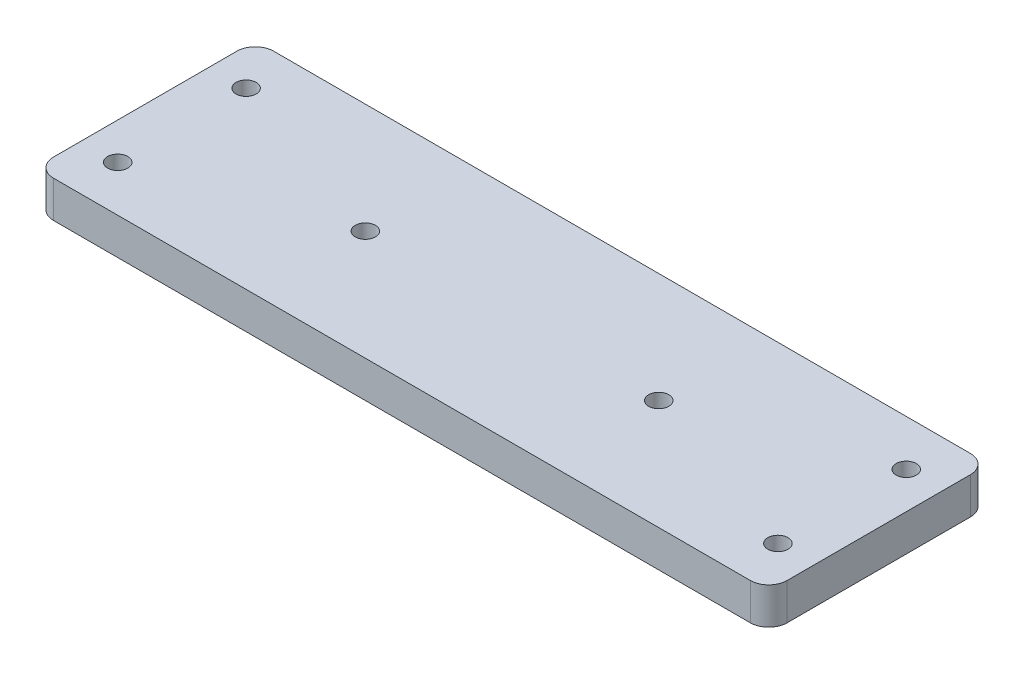
ISO-10303-21;
HEADER;
FILE_DESCRIPTION(('STEP AP214'),'2;1');
FILE_NAME('part.step','',(''),(''),'','','');
FILE_SCHEMA(('AUTOMOTIVE_DESIGN { 1 0 10303 214 1 1 1 1 }'));
ENDSEC;
DATA;
#1=APPLICATION_CONTEXT('core data for automotive mechanical design processes');
#2=APPLICATION_PROTOCOL_DEFINITION('international standard','automotive_design',2000,#1);
#3=PRODUCT_CONTEXT('',#1,'mechanical');
#4=PRODUCT('Part','Part','',(#3));
#5=PRODUCT_RELATED_PRODUCT_CATEGORY('part','',(#4));
#6=PRODUCT_DEFINITION_FORMATION('','',#4);
#7=PRODUCT_DEFINITION_CONTEXT('part definition',#1,'design');
#8=PRODUCT_DEFINITION('design','',#6,#7);
#9=PRODUCT_DEFINITION_SHAPE('','',#8);
#10=(LENGTH_UNIT() NAMED_UNIT(*) SI_UNIT(.MILLI.,.METRE.));
#11=(NAMED_UNIT(*) PLANE_ANGLE_UNIT() SI_UNIT($,.RADIAN.));
#12=(NAMED_UNIT(*) SI_UNIT($,.STERADIAN.) SOLID_ANGLE_UNIT());
#13=UNCERTAINTY_MEASURE_WITH_UNIT(LENGTH_MEASURE(1.E-05),#10,'distance_accuracy_value','');
#14=(GEOMETRIC_REPRESENTATION_CONTEXT(3) GLOBAL_UNCERTAINTY_ASSIGNED_CONTEXT((#13)) GLOBAL_UNIT_ASSIGNED_CONTEXT((#10,
#11,#12)) REPRESENTATION_CONTEXT('',''));
#15=CARTESIAN_POINT('',(0.,0.,0.));
#16=DIRECTION('',(0.,0.,1.));
#17=DIRECTION('',(1.,0.,0.));
#18=AXIS2_PLACEMENT_3D('',#15,#16,#17);
#19=CARTESIAN_POINT('',(95.,10.,-25.));
#20=DIRECTION('',(0.,1.,0.));
#21=DIRECTION('',(0.,0.,1.));
#22=AXIS2_PLACEMENT_3D('',#19,#20,#21);
#23=PLANE('',#22);
#24=CARTESIAN_POINT('',(-40.,10.,0.));
#25=DIRECTION('',(0.,1.,0.));
#26=DIRECTION('',(0.,0.,1.));
#27=AXIS2_PLACEMENT_3D('',#24,#25,#26);
#28=CIRCLE('',#27,2.75);
#29=CARTESIAN_POINT('',(-40.,10.,2.75));
#30=VERTEX_POINT('',#29);
#31=EDGE_CURVE('E203',#30,#30,#28,.T.);
#32=ORIENTED_EDGE('',*,*,#31,.F.);
#33=EDGE_LOOP('',(#32));
#34=FACE_BOUND('',#33,.T.);
#35=CARTESIAN_POINT('',(90.,10.,-17.5));
#36=DIRECTION('',(0.,1.,0.));
#37=DIRECTION('',(0.,0.,1.));
#38=AXIS2_PLACEMENT_3D('',#35,#36,#37);
#39=CIRCLE('',#38,2.75000000000001);
#40=CARTESIAN_POINT('',(90.,10.,-14.75));
#41=VERTEX_POINT('',#40);
#42=EDGE_CURVE('E191',#41,#41,#39,.T.);
#43=ORIENTED_EDGE('',*,*,#42,.F.);
#44=EDGE_LOOP('',(#43));
#45=FACE_BOUND('',#44,.T.);
#46=CARTESIAN_POINT('',(-90.,10.,-17.5));
#47=DIRECTION('',(0.,1.,0.));
#48=DIRECTION('',(0.,0.,1.));
#49=AXIS2_PLACEMENT_3D('',#46,#47,#48);
#50=CIRCLE('',#49,2.75000000000001);
#51=CARTESIAN_POINT('',(-90.,10.,-14.75));
#52=VERTEX_POINT('',#51);
#53=EDGE_CURVE('E137',#52,#52,#50,.T.);
#54=ORIENTED_EDGE('',*,*,#53,.F.);
#55=EDGE_LOOP('',(#54));
#56=FACE_BOUND('',#55,.T.);
#57=CARTESIAN_POINT('',(95.,10.,-25.));
#58=DIRECTION('',(0.,1.,0.));
#59=DIRECTION('',(0.,0.,1.));
#60=AXIS2_PLACEMENT_3D('',#57,#58,#59);
#61=CIRCLE('',#60,5.);
#62=CARTESIAN_POINT('',(100.,10.,-25.));
#63=VERTEX_POINT('',#62);
#64=CARTESIAN_POINT('',(95.,10.,-30.));
#65=VERTEX_POINT('',#64);
#66=EDGE_CURVE('E148',#63,#65,#61,.T.);
#67=ORIENTED_EDGE('',*,*,#66,.T.);
#68=DIRECTION('',(-1.,0.,0.));
#69=VECTOR('',#68,1.);
#70=CARTESIAN_POINT('',(-95.,10.,-30.));
#71=LINE('',#70,#69);
#72=CARTESIAN_POINT('',(-95.,10.,-30.));
#73=VERTEX_POINT('',#72);
#74=EDGE_CURVE('E96',#65,#73,#71,.T.);
#75=ORIENTED_EDGE('',*,*,#74,.T.);
#76=CARTESIAN_POINT('',(-95.,10.,-25.));
#77=DIRECTION('',(0.,1.,0.));
#78=DIRECTION('',(0.,0.,-1.));
#79=AXIS2_PLACEMENT_3D('',#76,#77,#78);
#80=CIRCLE('',#79,5.);
#81=CARTESIAN_POINT('',(-100.,10.,-25.));
#82=VERTEX_POINT('',#81);
#83=EDGE_CURVE('E163',#73,#82,#80,.T.);
#84=ORIENTED_EDGE('',*,*,#83,.T.);
#85=DIRECTION('',(0.,0.,1.));
#86=VECTOR('',#85,1.);
#87=CARTESIAN_POINT('',(-100.,10.,25.));
#88=LINE('',#87,#86);
#89=CARTESIAN_POINT('',(-100.,10.,25.));
#90=VERTEX_POINT('',#89);
#91=EDGE_CURVE('E176',#82,#90,#88,.T.);
#92=ORIENTED_EDGE('',*,*,#91,.T.);
#93=CARTESIAN_POINT('',(-95.,10.,25.));
#94=DIRECTION('',(0.,1.,0.));
#95=DIRECTION('',(0.,0.,-1.));
#96=AXIS2_PLACEMENT_3D('',#93,#94,#95);
#97=CIRCLE('',#96,5.);
#98=CARTESIAN_POINT('',(-95.,10.,30.));
#99=VERTEX_POINT('',#98);
#100=EDGE_CURVE('E115',#90,#99,#97,.T.);
#101=ORIENTED_EDGE('',*,*,#100,.T.);
#102=DIRECTION('',(1.,0.,0.));
#103=VECTOR('',#102,1.);
#104=CARTESIAN_POINT('',(-95.,10.,30.));
#105=LINE('',#104,#103);
#106=CARTESIAN_POINT('',(95.,10.,30.));
#107=VERTEX_POINT('',#106);
#108=EDGE_CURVE('E109',#99,#107,#105,.T.);
#109=ORIENTED_EDGE('',*,*,#108,.T.);
#110=CARTESIAN_POINT('',(95.,10.,25.));
#111=DIRECTION('',(0.,1.,0.));
#112=DIRECTION('',(0.,0.,1.));
#113=AXIS2_PLACEMENT_3D('',#110,#111,#112);
#114=CIRCLE('',#113,5.);
#115=CARTESIAN_POINT('',(100.,10.,25.));
#116=VERTEX_POINT('',#115);
#117=EDGE_CURVE('E113',#107,#116,#114,.T.);
#118=ORIENTED_EDGE('',*,*,#117,.T.);
#119=DIRECTION('',(0.,0.,-1.));
#120=VECTOR('',#119,1.);
#121=CARTESIAN_POINT('',(100.,10.,25.));
#122=LINE('',#121,#120);
#123=EDGE_CURVE('E53',#116,#63,#122,.T.);
#124=ORIENTED_EDGE('',*,*,#123,.T.);
#125=EDGE_LOOP('',(#67,#75,#84,#92,#101,#109,#118,#124));
#126=FACE_BOUND('',#125,.T.);
#127=CARTESIAN_POINT('',(-90.,10.,17.5));
#128=DIRECTION('',(0.,1.,0.));
#129=DIRECTION('',(0.,0.,1.));
#130=AXIS2_PLACEMENT_3D('',#127,#128,#129);
#131=CIRCLE('',#130,2.75000000000001);
#132=CARTESIAN_POINT('',(-90.,10.,20.25));
#133=VERTEX_POINT('',#132);
#134=EDGE_CURVE('E185',#133,#133,#131,.T.);
#135=ORIENTED_EDGE('',*,*,#134,.F.);
#136=EDGE_LOOP('',(#135));
#137=FACE_BOUND('',#136,.T.);
#138=CARTESIAN_POINT('',(90.,10.,17.5));
#139=DIRECTION('',(0.,1.,0.));
#140=DIRECTION('',(0.,0.,1.));
#141=AXIS2_PLACEMENT_3D('',#138,#139,#140);
#142=CIRCLE('',#141,2.75000000000001);
#143=CARTESIAN_POINT('',(90.,10.,20.25));
#144=VERTEX_POINT('',#143);
#145=EDGE_CURVE('E197',#144,#144,#142,.T.);
#146=ORIENTED_EDGE('',*,*,#145,.F.);
#147=EDGE_LOOP('',(#146));
#148=FACE_BOUND('',#147,.T.);
#149=CARTESIAN_POINT('',(40.,10.,0.));
#150=DIRECTION('',(0.,1.,0.));
#151=DIRECTION('',(0.,0.,1.));
#152=AXIS2_PLACEMENT_3D('',#149,#150,#151);
#153=CIRCLE('',#152,2.75);
#154=CARTESIAN_POINT('',(40.,10.,2.75));
#155=VERTEX_POINT('',#154);
#156=EDGE_CURVE('E209',#155,#155,#153,.T.);
#157=ORIENTED_EDGE('',*,*,#156,.F.);
#158=EDGE_LOOP('',(#157));
#159=FACE_BOUND('',#158,.T.);
#160=ADVANCED_FACE('F36',(#34,#45,#56,#126,#137,#148,#159),#23,.T.);
#161=CARTESIAN_POINT('',(95.,0.,-25.));
#162=DIRECTION('',(0.,1.,0.));
#163=DIRECTION('',(0.,0.,1.));
#164=AXIS2_PLACEMENT_3D('',#161,#162,#163);
#165=PLANE('',#164);
#166=CARTESIAN_POINT('',(95.,0.,-25.));
#167=DIRECTION('',(0.,1.,0.));
#168=DIRECTION('',(0.,0.,1.));
#169=AXIS2_PLACEMENT_3D('',#166,#167,#168);
#170=CIRCLE('',#169,5.);
#171=CARTESIAN_POINT('',(100.,0.,-25.));
#172=VERTEX_POINT('',#171);
#173=CARTESIAN_POINT('',(95.,0.,-30.));
#174=VERTEX_POINT('',#173);
#175=EDGE_CURVE('E133',#172,#174,#170,.T.);
#176=ORIENTED_EDGE('',*,*,#175,.F.);
#177=DIRECTION('',(0.,0.,-1.));
#178=VECTOR('',#177,1.);
#179=CARTESIAN_POINT('',(100.,0.,25.));
#180=LINE('',#179,#178);
#181=CARTESIAN_POINT('',(100.,0.,25.));
#182=VERTEX_POINT('',#181);
#183=EDGE_CURVE('E88',#182,#172,#180,.T.);
#184=ORIENTED_EDGE('',*,*,#183,.F.);
#185=CARTESIAN_POINT('',(95.,0.,25.));
#186=DIRECTION('',(0.,1.,0.));
#187=DIRECTION('',(0.,0.,1.));
#188=AXIS2_PLACEMENT_3D('',#185,#186,#187);
#189=CIRCLE('',#188,5.);
#190=CARTESIAN_POINT('',(95.,0.,30.));
#191=VERTEX_POINT('',#190);
#192=EDGE_CURVE('E82',#191,#182,#189,.T.);
#193=ORIENTED_EDGE('',*,*,#192,.F.);
#194=DIRECTION('',(1.,0.,0.));
#195=VECTOR('',#194,1.);
#196=CARTESIAN_POINT('',(-95.,0.,30.));
#197=LINE('',#196,#195);
#198=CARTESIAN_POINT('',(-95.,0.,30.));
#199=VERTEX_POINT('',#198);
#200=EDGE_CURVE('E123',#199,#191,#197,.T.);
#201=ORIENTED_EDGE('',*,*,#200,.F.);
#202=CARTESIAN_POINT('',(-95.,0.,25.));
#203=DIRECTION('',(0.,1.,0.));
#204=DIRECTION('',(0.,0.,-1.));
#205=AXIS2_PLACEMENT_3D('',#202,#203,#204);
#206=CIRCLE('',#205,5.);
#207=CARTESIAN_POINT('',(-100.,0.,25.));
#208=VERTEX_POINT('',#207);
#209=EDGE_CURVE('E143',#208,#199,#206,.T.);
#210=ORIENTED_EDGE('',*,*,#209,.F.);
#211=DIRECTION('',(0.,0.,1.));
#212=VECTOR('',#211,1.);
#213=CARTESIAN_POINT('',(-100.,0.,25.));
#214=LINE('',#213,#212);
#215=CARTESIAN_POINT('',(-100.,0.,-25.));
#216=VERTEX_POINT('',#215);
#217=EDGE_CURVE('E141',#216,#208,#214,.T.);
#218=ORIENTED_EDGE('',*,*,#217,.F.);
#219=CARTESIAN_POINT('',(-95.,0.,-25.));
#220=DIRECTION('',(0.,1.,0.));
#221=DIRECTION('',(0.,0.,-1.));
#222=AXIS2_PLACEMENT_3D('',#219,#220,#221);
#223=CIRCLE('',#222,5.);
#224=CARTESIAN_POINT('',(-95.,0.,-30.));
#225=VERTEX_POINT('',#224);
#226=EDGE_CURVE('E139',#225,#216,#223,.T.);
#227=ORIENTED_EDGE('',*,*,#226,.F.);
#228=DIRECTION('',(-1.,0.,0.));
#229=VECTOR('',#228,1.);
#230=CARTESIAN_POINT('',(-95.,0.,-30.));
#231=LINE('',#230,#229);
#232=EDGE_CURVE('E136',#174,#225,#231,.T.);
#233=ORIENTED_EDGE('',*,*,#232,.F.);
#234=EDGE_LOOP('',(#176,#184,#193,#201,#210,#218,#227,#233));
#235=FACE_BOUND('',#234,.T.);
#236=CARTESIAN_POINT('',(-90.,0.,-17.5));
#237=DIRECTION('',(0.,1.,0.));
#238=DIRECTION('',(0.,0.,1.));
#239=AXIS2_PLACEMENT_3D('',#236,#237,#238);
#240=CIRCLE('',#239,2.75000000000001);
#241=CARTESIAN_POINT('',(-90.,0.,-14.75));
#242=VERTEX_POINT('',#241);
#243=EDGE_CURVE('E182',#242,#242,#240,.T.);
#244=ORIENTED_EDGE('',*,*,#243,.T.);
#245=EDGE_LOOP('',(#244));
#246=FACE_BOUND('',#245,.T.);
#247=CARTESIAN_POINT('',(-90.,0.,17.5));
#248=DIRECTION('',(0.,1.,0.));
#249=DIRECTION('',(0.,0.,1.));
#250=AXIS2_PLACEMENT_3D('',#247,#248,#249);
#251=CIRCLE('',#250,2.75000000000001);
#252=CARTESIAN_POINT('',(-90.,0.,20.25));
#253=VERTEX_POINT('',#252);
#254=EDGE_CURVE('E188',#253,#253,#251,.T.);
#255=ORIENTED_EDGE('',*,*,#254,.T.);
#256=EDGE_LOOP('',(#255));
#257=FACE_BOUND('',#256,.T.);
#258=CARTESIAN_POINT('',(90.,0.,-17.5));
#259=DIRECTION('',(0.,1.,0.));
#260=DIRECTION('',(0.,0.,1.));
#261=AXIS2_PLACEMENT_3D('',#258,#259,#260);
#262=CIRCLE('',#261,2.75000000000001);
#263=CARTESIAN_POINT('',(90.,0.,-14.75));
#264=VERTEX_POINT('',#263);
#265=EDGE_CURVE('E194',#264,#264,#262,.T.);
#266=ORIENTED_EDGE('',*,*,#265,.T.);
#267=EDGE_LOOP('',(#266));
#268=FACE_BOUND('',#267,.T.);
#269=CARTESIAN_POINT('',(90.,0.,17.5));
#270=DIRECTION('',(0.,1.,0.));
#271=DIRECTION('',(0.,0.,1.));
#272=AXIS2_PLACEMENT_3D('',#269,#270,#271);
#273=CIRCLE('',#272,2.75000000000001);
#274=CARTESIAN_POINT('',(90.,0.,20.25));
#275=VERTEX_POINT('',#274);
#276=EDGE_CURVE('E200',#275,#275,#273,.T.);
#277=ORIENTED_EDGE('',*,*,#276,.T.);
#278=EDGE_LOOP('',(#277));
#279=FACE_BOUND('',#278,.T.);
#280=CARTESIAN_POINT('',(-40.,0.,0.));
#281=DIRECTION('',(0.,1.,0.));
#282=DIRECTION('',(0.,0.,1.));
#283=AXIS2_PLACEMENT_3D('',#280,#281,#282);
#284=CIRCLE('',#283,2.75);
#285=CARTESIAN_POINT('',(-40.,0.,2.75));
#286=VERTEX_POINT('',#285);
#287=EDGE_CURVE('E206',#286,#286,#284,.T.);
#288=ORIENTED_EDGE('',*,*,#287,.T.);
#289=EDGE_LOOP('',(#288));
#290=FACE_BOUND('',#289,.T.);
#291=CARTESIAN_POINT('',(40.,0.,0.));
#292=DIRECTION('',(0.,1.,0.));
#293=DIRECTION('',(0.,0.,1.));
#294=AXIS2_PLACEMENT_3D('',#291,#292,#293);
#295=CIRCLE('',#294,2.75);
#296=CARTESIAN_POINT('',(40.,0.,2.75));
#297=VERTEX_POINT('',#296);
#298=EDGE_CURVE('E212',#297,#297,#295,.T.);
#299=ORIENTED_EDGE('',*,*,#298,.T.);
#300=EDGE_LOOP('',(#299));
#301=FACE_BOUND('',#300,.T.);
#302=ADVANCED_FACE('F167',(#235,#246,#257,#268,#279,#290,#301),#165,.F.);
#303=CARTESIAN_POINT('',(95.,10.,-25.));
#304=DIRECTION('',(0.,-1.,0.));
#305=DIRECTION('',(0.,0.,-1.));
#306=AXIS2_PLACEMENT_3D('',#303,#304,#305);
#307=CYLINDRICAL_SURFACE('',#306,5.);
#308=ORIENTED_EDGE('',*,*,#175,.T.);
#309=DIRECTION('',(0.,-1.,0.));
#310=VECTOR('',#309,1.);
#311=CARTESIAN_POINT('',(95.,10.,-30.));
#312=LINE('',#311,#310);
#313=EDGE_CURVE('E11',#65,#174,#312,.T.);
#314=ORIENTED_EDGE('',*,*,#313,.F.);
#315=ORIENTED_EDGE('',*,*,#66,.F.);
#316=DIRECTION('',(0.,-1.,0.));
#317=VECTOR('',#316,1.);
#318=CARTESIAN_POINT('',(100.,10.,-25.));
#319=LINE('',#318,#317);
#320=EDGE_CURVE('E129',#63,#172,#319,.T.);
#321=ORIENTED_EDGE('',*,*,#320,.T.);
#322=EDGE_LOOP('',(#308,#314,#315,#321));
#323=FACE_BOUND('',#322,.T.);
#324=ADVANCED_FACE('F38',(#323),#307,.T.);
#325=CARTESIAN_POINT('',(-95.,10.,-30.));
#326=DIRECTION('',(0.,0.,1.));
#327=DIRECTION('',(1.,0.,0.));
#328=AXIS2_PLACEMENT_3D('',#325,#326,#327);
#329=PLANE('',#328);
#330=ORIENTED_EDGE('',*,*,#232,.T.);
#331=DIRECTION('',(0.,-1.,0.));
#332=VECTOR('',#331,1.);
#333=CARTESIAN_POINT('',(-95.,10.,-30.));
#334=LINE('',#333,#332);
#335=EDGE_CURVE('E45',#73,#225,#334,.T.);
#336=ORIENTED_EDGE('',*,*,#335,.F.);
#337=ORIENTED_EDGE('',*,*,#74,.F.);
#338=ORIENTED_EDGE('',*,*,#313,.T.);
#339=EDGE_LOOP('',(#330,#336,#337,#338));
#340=FACE_BOUND('',#339,.T.);
#341=ADVANCED_FACE('F246',(#340),#329,.F.);
#342=CARTESIAN_POINT('',(-95.,10.,-25.));
#343=DIRECTION('',(0.,-1.,0.));
#344=DIRECTION('',(0.,0.,-1.));
#345=AXIS2_PLACEMENT_3D('',#342,#343,#344);
#346=CYLINDRICAL_SURFACE('',#345,5.);
#347=ORIENTED_EDGE('',*,*,#226,.T.);
#348=DIRECTION('',(0.,-1.,0.));
#349=VECTOR('',#348,1.);
#350=CARTESIAN_POINT('',(-100.,10.,-25.));
#351=LINE('',#350,#349);
#352=EDGE_CURVE('E155',#82,#216,#351,.T.);
#353=ORIENTED_EDGE('',*,*,#352,.F.);
#354=ORIENTED_EDGE('',*,*,#83,.F.);
#355=ORIENTED_EDGE('',*,*,#335,.T.);
#356=EDGE_LOOP('',(#347,#353,#354,#355));
#357=FACE_BOUND('',#356,.T.);
#358=ADVANCED_FACE('F161',(#357),#346,.T.);
#359=CARTESIAN_POINT('',(-100.,10.,25.));
#360=DIRECTION('',(1.,0.,0.));
#361=DIRECTION('',(0.,0.,-1.));
#362=AXIS2_PLACEMENT_3D('',#359,#360,#361);
#363=PLANE('',#362);
#364=ORIENTED_EDGE('',*,*,#217,.T.);
#365=DIRECTION('',(0.,-1.,0.));
#366=VECTOR('',#365,1.);
#367=CARTESIAN_POINT('',(-100.,10.,25.));
#368=LINE('',#367,#366);
#369=EDGE_CURVE('E152',#90,#208,#368,.T.);
#370=ORIENTED_EDGE('',*,*,#369,.F.);
#371=ORIENTED_EDGE('',*,*,#91,.F.);
#372=ORIENTED_EDGE('',*,*,#352,.T.);
#373=EDGE_LOOP('',(#364,#370,#371,#372));
#374=FACE_BOUND('',#373,.T.);
#375=ADVANCED_FACE('F172',(#374),#363,.F.);
#376=CARTESIAN_POINT('',(-95.,10.,25.));
#377=DIRECTION('',(0.,-1.,0.));
#378=DIRECTION('',(0.,0.,-1.));
#379=AXIS2_PLACEMENT_3D('',#376,#377,#378);
#380=CYLINDRICAL_SURFACE('',#379,5.);
#381=ORIENTED_EDGE('',*,*,#209,.T.);
#382=DIRECTION('',(0.,-1.,0.));
#383=VECTOR('',#382,1.);
#384=CARTESIAN_POINT('',(-95.,10.,30.));
#385=LINE('',#384,#383);
#386=EDGE_CURVE('E124',#99,#199,#385,.T.);
#387=ORIENTED_EDGE('',*,*,#386,.F.);
#388=ORIENTED_EDGE('',*,*,#100,.F.);
#389=ORIENTED_EDGE('',*,*,#369,.T.);
#390=EDGE_LOOP('',(#381,#387,#388,#389));
#391=FACE_BOUND('',#390,.T.);
#392=ADVANCED_FACE('F175',(#391),#380,.T.);
#393=CARTESIAN_POINT('',(-95.,10.,30.));
#394=DIRECTION('',(0.,0.,-1.));
#395=DIRECTION('',(-1.,0.,0.));
#396=AXIS2_PLACEMENT_3D('',#393,#394,#395);
#397=PLANE('',#396);
#398=ORIENTED_EDGE('',*,*,#200,.T.);
#399=DIRECTION('',(0.,-1.,0.));
#400=VECTOR('',#399,1.);
#401=CARTESIAN_POINT('',(95.,10.,30.));
#402=LINE('',#401,#400);
#403=EDGE_CURVE('E120',#107,#191,#402,.T.);
#404=ORIENTED_EDGE('',*,*,#403,.F.);
#405=ORIENTED_EDGE('',*,*,#108,.F.);
#406=ORIENTED_EDGE('',*,*,#386,.T.);
#407=EDGE_LOOP('',(#398,#404,#405,#406));
#408=FACE_BOUND('',#407,.T.);
#409=ADVANCED_FACE('F121',(#408),#397,.F.);
#410=CARTESIAN_POINT('',(95.,10.,25.));
#411=DIRECTION('',(0.,-1.,0.));
#412=DIRECTION('',(0.,0.,-1.));
#413=AXIS2_PLACEMENT_3D('',#410,#411,#412);
#414=CYLINDRICAL_SURFACE('',#413,5.);
#415=ORIENTED_EDGE('',*,*,#192,.T.);
#416=DIRECTION('',(0.,-1.,0.));
#417=VECTOR('',#416,1.);
#418=CARTESIAN_POINT('',(100.,10.,25.));
#419=LINE('',#418,#417);
#420=EDGE_CURVE('E125',#116,#182,#419,.T.);
#421=ORIENTED_EDGE('',*,*,#420,.F.);
#422=ORIENTED_EDGE('',*,*,#117,.F.);
#423=ORIENTED_EDGE('',*,*,#403,.T.);
#424=EDGE_LOOP('',(#415,#421,#422,#423));
#425=FACE_BOUND('',#424,.T.);
#426=ADVANCED_FACE('F127',(#425),#414,.T.);
#427=CARTESIAN_POINT('',(100.,10.,25.));
#428=DIRECTION('',(-1.,0.,0.));
#429=DIRECTION('',(0.,0.,1.));
#430=AXIS2_PLACEMENT_3D('',#427,#428,#429);
#431=PLANE('',#430);
#432=ORIENTED_EDGE('',*,*,#183,.T.);
#433=ORIENTED_EDGE('',*,*,#320,.F.);
#434=ORIENTED_EDGE('',*,*,#123,.F.);
#435=ORIENTED_EDGE('',*,*,#420,.T.);
#436=EDGE_LOOP('',(#432,#433,#434,#435));
#437=FACE_BOUND('',#436,.T.);
#438=ADVANCED_FACE('F234',(#437),#431,.F.);
#439=CARTESIAN_POINT('',(-90.,10.,-17.5));
#440=DIRECTION('',(0.,-1.,0.));
#441=DIRECTION('',(0.,0.,-1.));
#442=AXIS2_PLACEMENT_3D('',#439,#440,#441);
#443=CYLINDRICAL_SURFACE('',#442,2.75000000000001);
#444=ORIENTED_EDGE('',*,*,#53,.T.);
#445=EDGE_LOOP('',(#444));
#446=FACE_BOUND('',#445,.T.);
#447=ORIENTED_EDGE('',*,*,#243,.F.);
#448=EDGE_LOOP('',(#447));
#449=FACE_BOUND('',#448,.T.);
#450=ADVANCED_FACE('F231',(#446,#449),#443,.F.);
#451=CARTESIAN_POINT('',(-90.,10.,17.5));
#452=DIRECTION('',(0.,-1.,0.));
#453=DIRECTION('',(0.,0.,-1.));
#454=AXIS2_PLACEMENT_3D('',#451,#452,#453);
#455=CYLINDRICAL_SURFACE('',#454,2.75000000000001);
#456=ORIENTED_EDGE('',*,*,#134,.T.);
#457=EDGE_LOOP('',(#456));
#458=FACE_BOUND('',#457,.T.);
#459=ORIENTED_EDGE('',*,*,#254,.F.);
#460=EDGE_LOOP('',(#459));
#461=FACE_BOUND('',#460,.T.);
#462=ADVANCED_FACE('F312',(#458,#461),#455,.F.);
#463=CARTESIAN_POINT('',(90.,10.,-17.5));
#464=DIRECTION('',(0.,-1.,0.));
#465=DIRECTION('',(0.,0.,-1.));
#466=AXIS2_PLACEMENT_3D('',#463,#464,#465);
#467=CYLINDRICAL_SURFACE('',#466,2.75000000000001);
#468=ORIENTED_EDGE('',*,*,#42,.T.);
#469=EDGE_LOOP('',(#468));
#470=FACE_BOUND('',#469,.T.);
#471=ORIENTED_EDGE('',*,*,#265,.F.);
#472=EDGE_LOOP('',(#471));
#473=FACE_BOUND('',#472,.T.);
#474=ADVANCED_FACE('F320',(#470,#473),#467,.F.);
#475=CARTESIAN_POINT('',(90.,10.,17.5));
#476=DIRECTION('',(0.,-1.,0.));
#477=DIRECTION('',(0.,0.,-1.));
#478=AXIS2_PLACEMENT_3D('',#475,#476,#477);
#479=CYLINDRICAL_SURFACE('',#478,2.75000000000001);
#480=ORIENTED_EDGE('',*,*,#145,.T.);
#481=EDGE_LOOP('',(#480));
#482=FACE_BOUND('',#481,.T.);
#483=ORIENTED_EDGE('',*,*,#276,.F.);
#484=EDGE_LOOP('',(#483));
#485=FACE_BOUND('',#484,.T.);
#486=ADVANCED_FACE('F328',(#482,#485),#479,.F.);
#487=CARTESIAN_POINT('',(-40.,10.,0.));
#488=DIRECTION('',(0.,-1.,0.));
#489=DIRECTION('',(0.,0.,-1.));
#490=AXIS2_PLACEMENT_3D('',#487,#488,#489);
#491=CYLINDRICAL_SURFACE('',#490,2.75);
#492=ORIENTED_EDGE('',*,*,#31,.T.);
#493=EDGE_LOOP('',(#492));
#494=FACE_BOUND('',#493,.T.);
#495=ORIENTED_EDGE('',*,*,#287,.F.);
#496=EDGE_LOOP('',(#495));
#497=FACE_BOUND('',#496,.T.);
#498=ADVANCED_FACE('F337',(#494,#497),#491,.F.);
#499=CARTESIAN_POINT('',(40.,10.,0.));
#500=DIRECTION('',(0.,-1.,0.));
#501=DIRECTION('',(0.,0.,-1.));
#502=AXIS2_PLACEMENT_3D('',#499,#500,#501);
#503=CYLINDRICAL_SURFACE('',#502,2.75);
#504=ORIENTED_EDGE('',*,*,#156,.T.);
#505=EDGE_LOOP('',(#504));
#506=FACE_BOUND('',#505,.T.);
#507=ORIENTED_EDGE('',*,*,#298,.F.);
#508=EDGE_LOOP('',(#507));
#509=FACE_BOUND('',#508,.T.);
#510=ADVANCED_FACE('F218',(#506,#509),#503,.F.);
#511=CLOSED_SHELL('',(#160,#302,#324,#341,#358,#375,#392,#409,#426,#438,#450,#462,#474,#486,
#498,#510));
#512=MANIFOLD_SOLID_BREP('B2',#511);
#513=ADVANCED_BREP_SHAPE_REPRESENTATION('',(#18,#512),#14);
#514=SHAPE_DEFINITION_REPRESENTATION(#9,#513);
ENDSEC;
END-ISO-10303-21;
